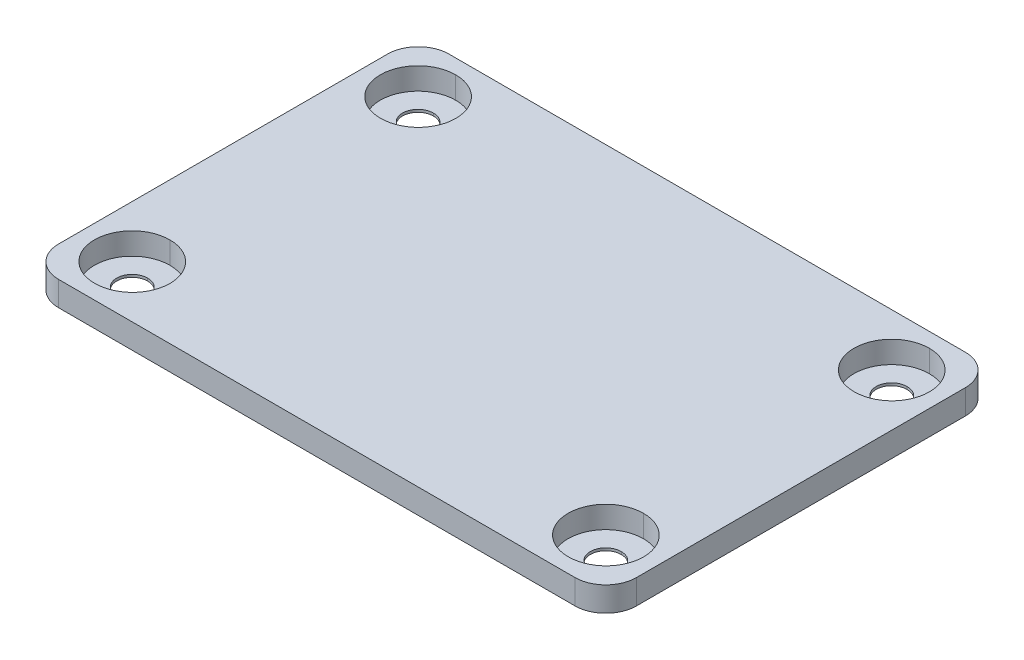
ISO-10303-21;
HEADER;
FILE_DESCRIPTION(('STEP AP214'),'2;1');
FILE_NAME('part.step','',(''),(''),'','','');
FILE_SCHEMA(('AUTOMOTIVE_DESIGN { 1 0 10303 214 1 1 1 1 }'));
ENDSEC;
DATA;
#1=APPLICATION_CONTEXT('core data for automotive mechanical design processes');
#2=APPLICATION_PROTOCOL_DEFINITION('international standard','automotive_design',2000,#1);
#3=PRODUCT_CONTEXT('',#1,'mechanical');
#4=PRODUCT('Part','Part','',(#3));
#5=PRODUCT_RELATED_PRODUCT_CATEGORY('part','',(#4));
#6=PRODUCT_DEFINITION_FORMATION('','',#4);
#7=PRODUCT_DEFINITION_CONTEXT('part definition',#1,'design');
#8=PRODUCT_DEFINITION('design','',#6,#7);
#9=PRODUCT_DEFINITION_SHAPE('','',#8);
#10=(LENGTH_UNIT() NAMED_UNIT(*) SI_UNIT(.MILLI.,.METRE.));
#11=(NAMED_UNIT(*) PLANE_ANGLE_UNIT() SI_UNIT($,.RADIAN.));
#12=(NAMED_UNIT(*) SI_UNIT($,.STERADIAN.) SOLID_ANGLE_UNIT());
#13=UNCERTAINTY_MEASURE_WITH_UNIT(LENGTH_MEASURE(1.E-05),#10,'distance_accuracy_value','');
#14=(GEOMETRIC_REPRESENTATION_CONTEXT(3) GLOBAL_UNCERTAINTY_ASSIGNED_CONTEXT((#13)) GLOBAL_UNIT_ASSIGNED_CONTEXT((#10,
#11,#12)) REPRESENTATION_CONTEXT('',''));
#15=CARTESIAN_POINT('',(0.,0.,0.));
#16=DIRECTION('',(0.,0.,1.));
#17=DIRECTION('',(1.,0.,0.));
#18=AXIS2_PLACEMENT_3D('',#15,#16,#17);
#19=CARTESIAN_POINT('',(-23.8468138885607,0.42,-47.7828830453356));
#20=DIRECTION('',(0.,-1.,0.));
#21=DIRECTION('',(0.,0.,-1.));
#22=AXIS2_PLACEMENT_3D('',#19,#20,#21);
#23=PLANE('',#22);
#24=CARTESIAN_POINT('',(-26.3468138885607,0.42,-47.7828830453356));
#25=DIRECTION('',(0.,1.,0.));
#26=DIRECTION('',(0.,0.,1.));
#27=AXIS2_PLACEMENT_3D('',#24,#25,#26);
#28=CIRCLE('',#27,6.12);
#29=CARTESIAN_POINT('',(-26.3218138885556,0.42,-53.902831983031));
#30=VERTEX_POINT('',#29);
#31=CARTESIAN_POINT('',(-26.3218138885658,0.42,-41.6629341076401));
#32=VERTEX_POINT('',#31);
#33=EDGE_CURVE('E226',#30,#32,#28,.T.);
#34=ORIENTED_EDGE('',*,*,#33,.T.);
#35=CARTESIAN_POINT('',(-26.2968138885607,0.42,-47.7828830453355));
#36=DIRECTION('',(0.,1.,0.));
#37=DIRECTION('',(0.,0.,1.));
#38=AXIS2_PLACEMENT_3D('',#35,#36,#37);
#39=CIRCLE('',#38,6.12);
#40=EDGE_CURVE('E686',#32,#30,#39,.T.);
#41=ORIENTED_EDGE('',*,*,#40,.T.);
#42=EDGE_LOOP('',(#34,#41));
#43=FACE_BOUND('',#42,.T.);
#44=CARTESIAN_POINT('',(-26.2968138885607,0.42,-47.7828830453355));
#45=DIRECTION('',(0.,1.,0.));
#46=DIRECTION('',(0.,0.,1.));
#47=AXIS2_PLACEMENT_3D('',#44,#45,#46);
#48=CIRCLE('',#47,2.5);
#49=CARTESIAN_POINT('',(-26.3218138885628,0.42,-45.2830080484607));
#50=VERTEX_POINT('',#49);
#51=CARTESIAN_POINT('',(-26.3218138885586,0.42,-50.2827580422104));
#52=VERTEX_POINT('',#51);
#53=EDGE_CURVE('E201',#50,#52,#48,.T.);
#54=ORIENTED_EDGE('',*,*,#53,.F.);
#55=CARTESIAN_POINT('',(-26.3468138885607,0.42,-47.7828830453356));
#56=DIRECTION('',(0.,1.,0.));
#57=DIRECTION('',(0.,0.,1.));
#58=AXIS2_PLACEMENT_3D('',#55,#56,#57);
#59=CIRCLE('',#58,2.5);
#60=EDGE_CURVE('E218',#52,#50,#59,.T.);
#61=ORIENTED_EDGE('',*,*,#60,.F.);
#62=EDGE_LOOP('',(#54,#61));
#63=FACE_BOUND('',#62,.T.);
#64=ADVANCED_FACE('F39',(#43,#63),#23,.F.);
#65=CARTESIAN_POINT('',(-23.8468138885607,0.42,-1.28288304533556));
#66=DIRECTION('',(0.,-1.,0.));
#67=DIRECTION('',(0.,0.,-1.));
#68=AXIS2_PLACEMENT_3D('',#65,#66,#67);
#69=PLANE('',#68);
#70=CARTESIAN_POINT('',(-26.3468138885607,0.42,-1.28288304533556));
#71=DIRECTION('',(0.,1.,0.));
#72=DIRECTION('',(0.,0.,1.));
#73=AXIS2_PLACEMENT_3D('',#70,#71,#72);
#74=CIRCLE('',#73,6.12);
#75=CARTESIAN_POINT('',(-26.3218138885596,0.42,-7.40283198303102));
#76=VERTEX_POINT('',#75);
#77=CARTESIAN_POINT('',(-26.3218138885619,0.42,4.83706589235992));
#78=VERTEX_POINT('',#77);
#79=EDGE_CURVE('E240',#76,#78,#74,.T.);
#80=ORIENTED_EDGE('',*,*,#79,.T.);
#81=CARTESIAN_POINT('',(-26.2968138885607,0.42,-1.28288304533555));
#82=DIRECTION('',(0.,1.,0.));
#83=DIRECTION('',(0.,0.,1.));
#84=AXIS2_PLACEMENT_3D('',#81,#82,#83);
#85=CIRCLE('',#84,6.12);
#86=EDGE_CURVE('E702',#78,#76,#85,.T.);
#87=ORIENTED_EDGE('',*,*,#86,.T.);
#88=EDGE_LOOP('',(#80,#87));
#89=FACE_BOUND('',#88,.T.);
#90=CARTESIAN_POINT('',(-26.2968138885607,0.42,-1.28288304533555));
#91=DIRECTION('',(0.,1.,0.));
#92=DIRECTION('',(0.,0.,1.));
#93=AXIS2_PLACEMENT_3D('',#90,#91,#92);
#94=CIRCLE('',#93,2.5);
#95=CARTESIAN_POINT('',(-26.3218138885612,0.42,1.21699195153929));
#96=VERTEX_POINT('',#95);
#97=CARTESIAN_POINT('',(-26.3218138885603,0.42,-3.78275804221039));
#98=VERTEX_POINT('',#97);
#99=EDGE_CURVE('E213',#96,#98,#94,.T.);
#100=ORIENTED_EDGE('',*,*,#99,.F.);
#101=CARTESIAN_POINT('',(-26.3468138885607,0.42,-1.28288304533556));
#102=DIRECTION('',(0.,1.,0.));
#103=DIRECTION('',(0.,0.,1.));
#104=AXIS2_PLACEMENT_3D('',#101,#102,#103);
#105=CIRCLE('',#104,2.5);
#106=EDGE_CURVE('E244',#98,#96,#105,.T.);
#107=ORIENTED_EDGE('',*,*,#106,.F.);
#108=EDGE_LOOP('',(#100,#107));
#109=FACE_BOUND('',#108,.T.);
#110=ADVANCED_FACE('F396',(#89,#109),#69,.F.);
#111=CARTESIAN_POINT('',(53.2031861114393,0.42,-47.7828830453356));
#112=DIRECTION('',(0.,-1.,0.));
#113=DIRECTION('',(0.,0.,-1.));
#114=AXIS2_PLACEMENT_3D('',#111,#112,#113);
#115=PLANE('',#114);
#116=CARTESIAN_POINT('',(50.7031861114393,0.42,-47.7828830453356));
#117=DIRECTION('',(0.,1.,0.));
#118=DIRECTION('',(0.,0.,1.));
#119=AXIS2_PLACEMENT_3D('',#116,#117,#118);
#120=CIRCLE('',#119,6.12);
#121=CARTESIAN_POINT('',(50.7281861114427,0.42,-53.902831983031));
#122=VERTEX_POINT('',#121);
#123=CARTESIAN_POINT('',(50.7281861114359,0.42,-41.6629341076401));
#124=VERTEX_POINT('',#123);
#125=EDGE_CURVE('E266',#122,#124,#120,.T.);
#126=ORIENTED_EDGE('',*,*,#125,.T.);
#127=CARTESIAN_POINT('',(50.7531861114393,0.42,-47.7828830453355));
#128=DIRECTION('',(0.,1.,0.));
#129=DIRECTION('',(0.,0.,1.));
#130=AXIS2_PLACEMENT_3D('',#127,#128,#129);
#131=CIRCLE('',#130,6.12);
#132=EDGE_CURVE('E731',#124,#122,#131,.T.);
#133=ORIENTED_EDGE('',*,*,#132,.T.);
#134=EDGE_LOOP('',(#126,#133));
#135=FACE_BOUND('',#134,.T.);
#136=CARTESIAN_POINT('',(50.7531861114393,0.42,-47.7828830453355));
#137=DIRECTION('',(0.,1.,0.));
#138=DIRECTION('',(0.,0.,1.));
#139=AXIS2_PLACEMENT_3D('',#136,#137,#138);
#140=CIRCLE('',#139,2.5);
#141=CARTESIAN_POINT('',(50.7281861114379,0.42,-45.2830080484607));
#142=VERTEX_POINT('',#141);
#143=CARTESIAN_POINT('',(50.7281861114407,0.42,-50.2827580422104));
#144=VERTEX_POINT('',#143);
#145=EDGE_CURVE('E708',#142,#144,#140,.T.);
#146=ORIENTED_EDGE('',*,*,#145,.F.);
#147=CARTESIAN_POINT('',(50.7031861114393,0.42,-47.7828830453356));
#148=DIRECTION('',(0.,1.,0.));
#149=DIRECTION('',(0.,0.,1.));
#150=AXIS2_PLACEMENT_3D('',#147,#148,#149);
#151=CIRCLE('',#150,2.5);
#152=EDGE_CURVE('E270',#144,#142,#151,.T.);
#153=ORIENTED_EDGE('',*,*,#152,.F.);
#154=EDGE_LOOP('',(#146,#153));
#155=FACE_BOUND('',#154,.T.);
#156=ADVANCED_FACE('F402',(#135,#155),#115,.F.);
#157=CARTESIAN_POINT('',(53.2031861114393,0.42,-1.28288304533555));
#158=DIRECTION('',(0.,-1.,0.));
#159=DIRECTION('',(0.,0.,-1.));
#160=AXIS2_PLACEMENT_3D('',#157,#158,#159);
#161=PLANE('',#160);
#162=CARTESIAN_POINT('',(50.7031861114393,0.42,-1.28288304533555));
#163=DIRECTION('',(0.,1.,0.));
#164=DIRECTION('',(0.,0.,1.));
#165=AXIS2_PLACEMENT_3D('',#162,#163,#164);
#166=CIRCLE('',#165,6.12);
#167=CARTESIAN_POINT('',(50.7281861114401,0.42,-7.40283198303103));
#168=VERTEX_POINT('',#167);
#169=CARTESIAN_POINT('',(50.7281861114384,0.42,4.83706589235993));
#170=VERTEX_POINT('',#169);
#171=EDGE_CURVE('E253',#168,#170,#166,.T.);
#172=ORIENTED_EDGE('',*,*,#171,.T.);
#173=CARTESIAN_POINT('',(50.7531861114393,0.42,-1.28288304533555));
#174=DIRECTION('',(0.,1.,0.));
#175=DIRECTION('',(0.,0.,1.));
#176=AXIS2_PLACEMENT_3D('',#173,#174,#175);
#177=CIRCLE('',#176,6.12);
#178=EDGE_CURVE('E759',#170,#168,#177,.T.);
#179=ORIENTED_EDGE('',*,*,#178,.T.);
#180=EDGE_LOOP('',(#172,#179));
#181=FACE_BOUND('',#180,.T.);
#182=CARTESIAN_POINT('',(50.7531861114393,0.42,-1.28288304533555));
#183=DIRECTION('',(0.,1.,0.));
#184=DIRECTION('',(0.,0.,1.));
#185=AXIS2_PLACEMENT_3D('',#182,#183,#184);
#186=CIRCLE('',#185,2.5);
#187=CARTESIAN_POINT('',(50.7281861114389,0.42,1.21699195153929));
#188=VERTEX_POINT('',#187);
#189=CARTESIAN_POINT('',(50.7281861114396,0.42,-3.78275804221039));
#190=VERTEX_POINT('',#189);
#191=EDGE_CURVE('E290',#188,#190,#186,.T.);
#192=ORIENTED_EDGE('',*,*,#191,.F.);
#193=CARTESIAN_POINT('',(50.7031861114393,0.42,-1.28288304533555));
#194=DIRECTION('',(0.,1.,0.));
#195=DIRECTION('',(0.,0.,1.));
#196=AXIS2_PLACEMENT_3D('',#193,#194,#195);
#197=CIRCLE('',#196,2.5);
#198=EDGE_CURVE('E257',#190,#188,#197,.T.);
#199=ORIENTED_EDGE('',*,*,#198,.F.);
#200=EDGE_LOOP('',(#192,#199));
#201=FACE_BOUND('',#200,.T.);
#202=ADVANCED_FACE('F424',(#181,#201),#161,.F.);
#203=CARTESIAN_POINT('',(-34.7968138885607,4.,-56.2828830453355));
#204=DIRECTION('',(1.,0.,0.));
#205=DIRECTION('',(0.,0.,-1.));
#206=AXIS2_PLACEMENT_3D('',#203,#204,#205);
#207=PLANE('',#206);
#208=DIRECTION('',(0.,0.,1.));
#209=VECTOR('',#208,1.);
#210=CARTESIAN_POINT('',(-34.7968138885607,0.,-56.2828830453355));
#211=LINE('',#210,#209);
#212=CARTESIAN_POINT('',(-34.7968138885607,0.,-51.2828830453356));
#213=VERTEX_POINT('',#212);
#214=CARTESIAN_POINT('',(-34.7968138885607,0.,2.21711695466446));
#215=VERTEX_POINT('',#214);
#216=EDGE_CURVE('E291',#213,#215,#211,.T.);
#217=ORIENTED_EDGE('',*,*,#216,.T.);
#218=DIRECTION('',(0.,-1.,0.));
#219=VECTOR('',#218,1.);
#220=CARTESIAN_POINT('',(-34.7968138885607,4.,2.21711695466446));
#221=LINE('',#220,#219);
#222=CARTESIAN_POINT('',(-34.7968138885607,4.,2.21711695466446));
#223=VERTEX_POINT('',#222);
#224=EDGE_CURVE('E11',#215,#223,#221,.F.);
#225=ORIENTED_EDGE('',*,*,#224,.T.);
#226=DIRECTION('',(0.,0.,1.));
#227=VECTOR('',#226,1.);
#228=CARTESIAN_POINT('',(-34.7968138885607,4.,-56.2828830453355));
#229=LINE('',#228,#227);
#230=CARTESIAN_POINT('',(-34.7968138885607,4.,-51.2828830453356));
#231=VERTEX_POINT('',#230);
#232=EDGE_CURVE('E275',#231,#223,#229,.T.);
#233=ORIENTED_EDGE('',*,*,#232,.F.);
#234=DIRECTION('',(0.,-1.,0.));
#235=VECTOR('',#234,1.);
#236=CARTESIAN_POINT('',(-34.7968138885607,4.,-51.2828830453356));
#237=LINE('',#236,#235);
#238=EDGE_CURVE('E48',#231,#213,#237,.T.);
#239=ORIENTED_EDGE('',*,*,#238,.T.);
#240=EDGE_LOOP('',(#217,#225,#233,#239));
#241=FACE_BOUND('',#240,.T.);
#242=ADVANCED_FACE('F361',(#241),#207,.F.);
#243=CARTESIAN_POINT('',(-34.7968138885607,4.,7.21711695466445));
#244=DIRECTION('',(0.,0.,-1.));
#245=DIRECTION('',(-1.,0.,0.));
#246=AXIS2_PLACEMENT_3D('',#243,#244,#245);
#247=PLANE('',#246);
#248=DIRECTION('',(1.,0.,0.));
#249=VECTOR('',#248,1.);
#250=CARTESIAN_POINT('',(-34.7968138885607,0.,7.21711695466445));
#251=LINE('',#250,#249);
#252=CARTESIAN_POINT('',(-29.7968138885607,0.,7.21711695466445));
#253=VERTEX_POINT('',#252);
#254=CARTESIAN_POINT('',(54.2031861114393,0.,7.21711695466445));
#255=VERTEX_POINT('',#254);
#256=EDGE_CURVE('E295',#253,#255,#251,.T.);
#257=ORIENTED_EDGE('',*,*,#256,.T.);
#258=DIRECTION('',(0.,-1.,0.));
#259=VECTOR('',#258,1.);
#260=CARTESIAN_POINT('',(54.2031861114393,4.,7.21711695466445));
#261=LINE('',#260,#259);
#262=CARTESIAN_POINT('',(54.2031861114393,4.,7.21711695466445));
#263=VERTEX_POINT('',#262);
#264=EDGE_CURVE('E336',#255,#263,#261,.F.);
#265=ORIENTED_EDGE('',*,*,#264,.T.);
#266=DIRECTION('',(1.,0.,0.));
#267=VECTOR('',#266,1.);
#268=CARTESIAN_POINT('',(-34.7968138885607,4.,7.21711695466445));
#269=LINE('',#268,#267);
#270=CARTESIAN_POINT('',(-29.7968138885607,4.,7.21711695466445));
#271=VERTEX_POINT('',#270);
#272=EDGE_CURVE('E279',#271,#263,#269,.T.);
#273=ORIENTED_EDGE('',*,*,#272,.F.);
#274=DIRECTION('',(0.,-1.,0.));
#275=VECTOR('',#274,1.);
#276=CARTESIAN_POINT('',(-29.7968138885607,4.,7.21711695466445));
#277=LINE('',#276,#275);
#278=EDGE_CURVE('E332',#271,#253,#277,.T.);
#279=ORIENTED_EDGE('',*,*,#278,.T.);
#280=EDGE_LOOP('',(#257,#265,#273,#279));
#281=FACE_BOUND('',#280,.T.);
#282=ADVANCED_FACE('F376',(#281),#247,.F.);
#283=CARTESIAN_POINT('',(59.2031861114393,4.,-56.2828830453355));
#284=DIRECTION('',(-1.,0.,0.));
#285=DIRECTION('',(0.,0.,1.));
#286=AXIS2_PLACEMENT_3D('',#283,#284,#285);
#287=PLANE('',#286);
#288=DIRECTION('',(0.,0.,-1.));
#289=VECTOR('',#288,1.);
#290=CARTESIAN_POINT('',(59.2031861114393,4.,-56.2828830453355));
#291=LINE('',#290,#289);
#292=CARTESIAN_POINT('',(59.2031861114393,4.,2.21711695466446));
#293=VERTEX_POINT('',#292);
#294=CARTESIAN_POINT('',(59.2031861114393,4.,-51.2828830453356));
#295=VERTEX_POINT('',#294);
#296=EDGE_CURVE('E284',#293,#295,#291,.T.);
#297=ORIENTED_EDGE('',*,*,#296,.F.);
#298=DIRECTION('',(0.,-1.,0.));
#299=VECTOR('',#298,1.);
#300=CARTESIAN_POINT('',(59.2031861114393,4.,2.21711695466446));
#301=LINE('',#300,#299);
#302=CARTESIAN_POINT('',(59.2031861114393,0.,2.21711695466446));
#303=VERTEX_POINT('',#302);
#304=EDGE_CURVE('E316',#293,#303,#301,.T.);
#305=ORIENTED_EDGE('',*,*,#304,.T.);
#306=DIRECTION('',(0.,0.,-1.));
#307=VECTOR('',#306,1.);
#308=CARTESIAN_POINT('',(59.2031861114393,0.,-56.2828830453355));
#309=LINE('',#308,#307);
#310=CARTESIAN_POINT('',(59.2031861114393,0.,-51.2828830453356));
#311=VERTEX_POINT('',#310);
#312=EDGE_CURVE('E299',#303,#311,#309,.T.);
#313=ORIENTED_EDGE('',*,*,#312,.T.);
#314=DIRECTION('',(0.,-1.,0.));
#315=VECTOR('',#314,1.);
#316=CARTESIAN_POINT('',(59.2031861114393,4.,-51.2828830453356));
#317=LINE('',#316,#315);
#318=EDGE_CURVE('E212',#311,#295,#317,.F.);
#319=ORIENTED_EDGE('',*,*,#318,.T.);
#320=EDGE_LOOP('',(#297,#305,#313,#319));
#321=FACE_BOUND('',#320,.T.);
#322=ADVANCED_FACE('F385',(#321),#287,.F.);
#323=CARTESIAN_POINT('',(-34.7968138885607,4.,-56.2828830453355));
#324=DIRECTION('',(0.,0.,1.));
#325=DIRECTION('',(1.,0.,0.));
#326=AXIS2_PLACEMENT_3D('',#323,#324,#325);
#327=PLANE('',#326);
#328=DIRECTION('',(-1.,0.,0.));
#329=VECTOR('',#328,1.);
#330=CARTESIAN_POINT('',(-34.7968138885607,4.,-56.2828830453355));
#331=LINE('',#330,#329);
#332=CARTESIAN_POINT('',(54.2031861114393,4.,-56.2828830453355));
#333=VERTEX_POINT('',#332);
#334=CARTESIAN_POINT('',(-29.7968138885607,4.,-56.2828830453355));
#335=VERTEX_POINT('',#334);
#336=EDGE_CURVE('E287',#333,#335,#331,.T.);
#337=ORIENTED_EDGE('',*,*,#336,.F.);
#338=DIRECTION('',(0.,-1.,0.));
#339=VECTOR('',#338,1.);
#340=CARTESIAN_POINT('',(54.2031861114393,4.,-56.2828830453355));
#341=LINE('',#340,#339);
#342=CARTESIAN_POINT('',(54.2031861114393,0.,-56.2828830453355));
#343=VERTEX_POINT('',#342);
#344=EDGE_CURVE('E352',#333,#343,#341,.T.);
#345=ORIENTED_EDGE('',*,*,#344,.T.);
#346=DIRECTION('',(-1.,0.,0.));
#347=VECTOR('',#346,1.);
#348=CARTESIAN_POINT('',(-34.7968138885607,0.,-56.2828830453355));
#349=LINE('',#348,#347);
#350=CARTESIAN_POINT('',(-29.7968138885607,0.,-56.2828830453355));
#351=VERTEX_POINT('',#350);
#352=EDGE_CURVE('E280',#343,#351,#349,.T.);
#353=ORIENTED_EDGE('',*,*,#352,.T.);
#354=DIRECTION('',(0.,-1.,0.));
#355=VECTOR('',#354,1.);
#356=CARTESIAN_POINT('',(-29.7968138885607,4.,-56.2828830453355));
#357=LINE('',#356,#355);
#358=EDGE_CURVE('E55',#351,#335,#357,.F.);
#359=ORIENTED_EDGE('',*,*,#358,.T.);
#360=EDGE_LOOP('',(#337,#345,#353,#359));
#361=FACE_BOUND('',#360,.T.);
#362=ADVANCED_FACE('F390',(#361),#327,.F.);
#363=CARTESIAN_POINT('',(0.,4.,0.));
#364=DIRECTION('',(0.,1.,0.));
#365=DIRECTION('',(0.,0.,1.));
#366=AXIS2_PLACEMENT_3D('',#363,#364,#365);
#367=PLANE('',#366);
#368=CARTESIAN_POINT('',(-26.2968138885607,4.,-47.7828830453355));
#369=DIRECTION('',(0.,1.,0.));
#370=DIRECTION('',(0.,0.,1.));
#371=AXIS2_PLACEMENT_3D('',#368,#369,#370);
#372=CIRCLE('',#371,6.12);
#373=CARTESIAN_POINT('',(-26.3218138885658,4.,-41.6629341076401));
#374=VERTEX_POINT('',#373);
#375=CARTESIAN_POINT('',(-26.3218138885556,4.,-53.902831983031));
#376=VERTEX_POINT('',#375);
#377=EDGE_CURVE('E688',#374,#376,#372,.T.);
#378=ORIENTED_EDGE('',*,*,#377,.F.);
#379=CARTESIAN_POINT('',(-26.3468138885607,4.,-47.7828830453356));
#380=DIRECTION('',(0.,1.,0.));
#381=DIRECTION('',(0.,0.,1.));
#382=AXIS2_PLACEMENT_3D('',#379,#380,#381);
#383=CIRCLE('',#382,6.12);
#384=EDGE_CURVE('E233',#376,#374,#383,.T.);
#385=ORIENTED_EDGE('',*,*,#384,.F.);
#386=EDGE_LOOP('',(#378,#385));
#387=FACE_BOUND('',#386,.T.);
#388=CARTESIAN_POINT('',(-26.2968138885607,4.,-1.28288304533555));
#389=DIRECTION('',(0.,1.,0.));
#390=DIRECTION('',(0.,0.,1.));
#391=AXIS2_PLACEMENT_3D('',#388,#389,#390);
#392=CIRCLE('',#391,6.12);
#393=CARTESIAN_POINT('',(-26.3218138885619,4.,4.83706589235992));
#394=VERTEX_POINT('',#393);
#395=CARTESIAN_POINT('',(-26.3218138885596,4.,-7.40283198303103));
#396=VERTEX_POINT('',#395);
#397=EDGE_CURVE('E222',#394,#396,#392,.T.);
#398=ORIENTED_EDGE('',*,*,#397,.F.);
#399=CARTESIAN_POINT('',(-26.3468138885607,4.,-1.28288304533556));
#400=DIRECTION('',(0.,1.,0.));
#401=DIRECTION('',(0.,0.,1.));
#402=AXIS2_PLACEMENT_3D('',#399,#400,#401);
#403=CIRCLE('',#402,6.12);
#404=EDGE_CURVE('E230',#396,#394,#403,.T.);
#405=ORIENTED_EDGE('',*,*,#404,.F.);
#406=EDGE_LOOP('',(#398,#405));
#407=FACE_BOUND('',#406,.T.);
#408=CARTESIAN_POINT('',(50.7531861114393,4.,-47.7828830453355));
#409=DIRECTION('',(0.,1.,0.));
#410=DIRECTION('',(0.,0.,1.));
#411=AXIS2_PLACEMENT_3D('',#408,#409,#410);
#412=CIRCLE('',#411,6.12);
#413=CARTESIAN_POINT('',(50.7281861114359,4.,-41.6629341076401));
#414=VERTEX_POINT('',#413);
#415=CARTESIAN_POINT('',(50.7281861114427,4.,-53.902831983031));
#416=VERTEX_POINT('',#415);
#417=EDGE_CURVE('E728',#414,#416,#412,.T.);
#418=ORIENTED_EDGE('',*,*,#417,.F.);
#419=CARTESIAN_POINT('',(50.7031861114393,4.,-47.7828830453356));
#420=DIRECTION('',(0.,1.,0.));
#421=DIRECTION('',(0.,0.,1.));
#422=AXIS2_PLACEMENT_3D('',#419,#420,#421);
#423=CIRCLE('',#422,6.12);
#424=EDGE_CURVE('E262',#416,#414,#423,.T.);
#425=ORIENTED_EDGE('',*,*,#424,.F.);
#426=EDGE_LOOP('',(#418,#425));
#427=FACE_BOUND('',#426,.T.);
#428=CARTESIAN_POINT('',(50.7531861114393,4.,-1.28288304533555));
#429=DIRECTION('',(0.,1.,0.));
#430=DIRECTION('',(0.,0.,1.));
#431=AXIS2_PLACEMENT_3D('',#428,#429,#430);
#432=CIRCLE('',#431,6.12);
#433=CARTESIAN_POINT('',(50.7281861114384,4.,4.83706589235993));
#434=VERTEX_POINT('',#433);
#435=CARTESIAN_POINT('',(50.7281861114401,4.,-7.40283198303103));
#436=VERTEX_POINT('',#435);
#437=EDGE_CURVE('E756',#434,#436,#432,.T.);
#438=ORIENTED_EDGE('',*,*,#437,.F.);
#439=CARTESIAN_POINT('',(50.7031861114393,4.,-1.28288304533555));
#440=DIRECTION('',(0.,1.,0.));
#441=DIRECTION('',(0.,0.,1.));
#442=AXIS2_PLACEMENT_3D('',#439,#440,#441);
#443=CIRCLE('',#442,6.12);
#444=EDGE_CURVE('E249',#436,#434,#443,.T.);
#445=ORIENTED_EDGE('',*,*,#444,.F.);
#446=EDGE_LOOP('',(#438,#445));
#447=FACE_BOUND('',#446,.T.);
#448=ORIENTED_EDGE('',*,*,#272,.T.);
#449=CARTESIAN_POINT('',(54.2031861114393,4.,2.21711695466446));
#450=DIRECTION('',(0.,1.,0.));
#451=DIRECTION('',(0.,0.,1.));
#452=AXIS2_PLACEMENT_3D('',#449,#450,#451);
#453=CIRCLE('',#452,5.);
#454=EDGE_CURVE('E347',#263,#293,#453,.T.);
#455=ORIENTED_EDGE('',*,*,#454,.T.);
#456=ORIENTED_EDGE('',*,*,#296,.T.);
#457=CARTESIAN_POINT('',(54.2031861114393,4.,-51.2828830453356));
#458=DIRECTION('',(0.,1.,0.));
#459=DIRECTION('',(0.,0.,1.));
#460=AXIS2_PLACEMENT_3D('',#457,#458,#459);
#461=CIRCLE('',#460,5.);
#462=EDGE_CURVE('E62',#295,#333,#461,.T.);
#463=ORIENTED_EDGE('',*,*,#462,.T.);
#464=ORIENTED_EDGE('',*,*,#336,.T.);
#465=CARTESIAN_POINT('',(-29.7968138885607,4.,-51.2828830453356));
#466=DIRECTION('',(0.,1.,0.));
#467=DIRECTION('',(0.,0.,1.));
#468=AXIS2_PLACEMENT_3D('',#465,#466,#467);
#469=CIRCLE('',#468,5.);
#470=EDGE_CURVE('E339',#335,#231,#469,.T.);
#471=ORIENTED_EDGE('',*,*,#470,.T.);
#472=ORIENTED_EDGE('',*,*,#232,.T.);
#473=CARTESIAN_POINT('',(-29.7968138885607,4.,2.21711695466445));
#474=DIRECTION('',(0.,1.,0.));
#475=DIRECTION('',(0.,0.,1.));
#476=AXIS2_PLACEMENT_3D('',#473,#474,#475);
#477=CIRCLE('',#476,5.);
#478=EDGE_CURVE('E342',#223,#271,#477,.T.);
#479=ORIENTED_EDGE('',*,*,#478,.T.);
#480=EDGE_LOOP('',(#448,#455,#456,#463,#464,#471,#472,#479));
#481=FACE_BOUND('',#480,.T.);
#482=ADVANCED_FACE('F379',(#387,#407,#427,#447,#481),#367,.T.);
#483=CARTESIAN_POINT('',(0.,0.,0.));
#484=DIRECTION('',(0.,1.,0.));
#485=DIRECTION('',(0.,0.,1.));
#486=AXIS2_PLACEMENT_3D('',#483,#484,#485);
#487=PLANE('',#486);
#488=CARTESIAN_POINT('',(-26.3468138885607,0.,-47.7828830453356));
#489=DIRECTION('',(0.,1.,0.));
#490=DIRECTION('',(0.,0.,1.));
#491=AXIS2_PLACEMENT_3D('',#488,#489,#490);
#492=CIRCLE('',#491,2.5);
#493=CARTESIAN_POINT('',(-26.3218138885586,0.,-50.2827580422104));
#494=VERTEX_POINT('',#493);
#495=CARTESIAN_POINT('',(-26.3218138885628,0.,-45.2830080484607));
#496=VERTEX_POINT('',#495);
#497=EDGE_CURVE('E220',#494,#496,#492,.T.);
#498=ORIENTED_EDGE('',*,*,#497,.T.);
#499=CARTESIAN_POINT('',(-26.2968138885607,0.,-47.7828830453355));
#500=DIRECTION('',(0.,1.,0.));
#501=DIRECTION('',(0.,0.,1.));
#502=AXIS2_PLACEMENT_3D('',#499,#500,#501);
#503=CIRCLE('',#502,2.5);
#504=EDGE_CURVE('E223',#496,#494,#503,.T.);
#505=ORIENTED_EDGE('',*,*,#504,.T.);
#506=EDGE_LOOP('',(#498,#505));
#507=FACE_BOUND('',#506,.T.);
#508=CARTESIAN_POINT('',(-26.3468138885607,0.,-1.28288304533556));
#509=DIRECTION('',(0.,1.,0.));
#510=DIRECTION('',(0.,0.,1.));
#511=AXIS2_PLACEMENT_3D('',#508,#509,#510);
#512=CIRCLE('',#511,2.5);
#513=CARTESIAN_POINT('',(-26.3218138885603,0.,-3.78275804221039));
#514=VERTEX_POINT('',#513);
#515=CARTESIAN_POINT('',(-26.3218138885612,0.,1.21699195153929));
#516=VERTEX_POINT('',#515);
#517=EDGE_CURVE('E248',#514,#516,#512,.T.);
#518=ORIENTED_EDGE('',*,*,#517,.T.);
#519=CARTESIAN_POINT('',(-26.2968138885607,0.,-1.28288304533555));
#520=DIRECTION('',(0.,1.,0.));
#521=DIRECTION('',(0.,0.,1.));
#522=AXIS2_PLACEMENT_3D('',#519,#520,#521);
#523=CIRCLE('',#522,2.5);
#524=EDGE_CURVE('E720',#516,#514,#523,.T.);
#525=ORIENTED_EDGE('',*,*,#524,.T.);
#526=EDGE_LOOP('',(#518,#525));
#527=FACE_BOUND('',#526,.T.);
#528=CARTESIAN_POINT('',(50.7031861114393,0.,-1.28288304533555));
#529=DIRECTION('',(0.,1.,0.));
#530=DIRECTION('',(0.,0.,1.));
#531=AXIS2_PLACEMENT_3D('',#528,#529,#530);
#532=CIRCLE('',#531,2.5);
#533=CARTESIAN_POINT('',(50.7281861114396,0.,-3.78275804221039));
#534=VERTEX_POINT('',#533);
#535=CARTESIAN_POINT('',(50.7281861114389,0.,1.21699195153929));
#536=VERTEX_POINT('',#535);
#537=EDGE_CURVE('E261',#534,#536,#532,.T.);
#538=ORIENTED_EDGE('',*,*,#537,.T.);
#539=CARTESIAN_POINT('',(50.7531861114393,0.,-1.28288304533555));
#540=DIRECTION('',(0.,1.,0.));
#541=DIRECTION('',(0.,0.,1.));
#542=AXIS2_PLACEMENT_3D('',#539,#540,#541);
#543=CIRCLE('',#542,2.5);
#544=EDGE_CURVE('E768',#536,#534,#543,.T.);
#545=ORIENTED_EDGE('',*,*,#544,.T.);
#546=EDGE_LOOP('',(#538,#545));
#547=FACE_BOUND('',#546,.T.);
#548=CARTESIAN_POINT('',(50.7031861114393,0.,-47.7828830453356));
#549=DIRECTION('',(0.,1.,0.));
#550=DIRECTION('',(0.,0.,1.));
#551=AXIS2_PLACEMENT_3D('',#548,#549,#550);
#552=CIRCLE('',#551,2.5);
#553=CARTESIAN_POINT('',(50.7281861114407,0.,-50.2827580422104));
#554=VERTEX_POINT('',#553);
#555=CARTESIAN_POINT('',(50.7281861114379,0.,-45.2830080484607));
#556=VERTEX_POINT('',#555);
#557=EDGE_CURVE('E274',#554,#556,#552,.T.);
#558=ORIENTED_EDGE('',*,*,#557,.T.);
#559=CARTESIAN_POINT('',(50.7531861114393,0.,-47.7828830453355));
#560=DIRECTION('',(0.,1.,0.));
#561=DIRECTION('',(0.,0.,1.));
#562=AXIS2_PLACEMENT_3D('',#559,#560,#561);
#563=CIRCLE('',#562,2.5);
#564=EDGE_CURVE('E748',#556,#554,#563,.T.);
#565=ORIENTED_EDGE('',*,*,#564,.T.);
#566=EDGE_LOOP('',(#558,#565));
#567=FACE_BOUND('',#566,.T.);
#568=ORIENTED_EDGE('',*,*,#312,.F.);
#569=CARTESIAN_POINT('',(54.2031861114393,0.,2.21711695466446));
#570=DIRECTION('',(0.,1.,0.));
#571=DIRECTION('',(0.,0.,1.));
#572=AXIS2_PLACEMENT_3D('',#569,#570,#571);
#573=CIRCLE('',#572,5.);
#574=EDGE_CURVE('E329',#303,#255,#573,.F.);
#575=ORIENTED_EDGE('',*,*,#574,.T.);
#576=ORIENTED_EDGE('',*,*,#256,.F.);
#577=CARTESIAN_POINT('',(-29.7968138885607,0.,2.21711695466445));
#578=DIRECTION('',(0.,1.,0.));
#579=DIRECTION('',(0.,0.,1.));
#580=AXIS2_PLACEMENT_3D('',#577,#578,#579);
#581=CIRCLE('',#580,5.);
#582=EDGE_CURVE('E323',#253,#215,#581,.F.);
#583=ORIENTED_EDGE('',*,*,#582,.T.);
#584=ORIENTED_EDGE('',*,*,#216,.F.);
#585=CARTESIAN_POINT('',(-29.7968138885607,0.,-51.2828830453356));
#586=DIRECTION('',(0.,1.,0.));
#587=DIRECTION('',(0.,0.,1.));
#588=AXIS2_PLACEMENT_3D('',#585,#586,#587);
#589=CIRCLE('',#588,5.);
#590=EDGE_CURVE('E320',#213,#351,#589,.F.);
#591=ORIENTED_EDGE('',*,*,#590,.T.);
#592=ORIENTED_EDGE('',*,*,#352,.F.);
#593=CARTESIAN_POINT('',(54.2031861114393,0.,-51.2828830453356));
#594=DIRECTION('',(0.,1.,0.));
#595=DIRECTION('',(0.,0.,1.));
#596=AXIS2_PLACEMENT_3D('',#593,#594,#595);
#597=CIRCLE('',#596,5.);
#598=EDGE_CURVE('E326',#343,#311,#597,.F.);
#599=ORIENTED_EDGE('',*,*,#598,.T.);
#600=EDGE_LOOP('',(#568,#575,#576,#583,#584,#591,#592,#599));
#601=FACE_BOUND('',#600,.T.);
#602=ADVANCED_FACE('F367',(#507,#527,#547,#567,#601),#487,.F.);
#603=CARTESIAN_POINT('',(50.7031861114393,4.,-47.7828830453356));
#604=DIRECTION('',(0.,1.,0.));
#605=DIRECTION('',(0.,0.,1.));
#606=AXIS2_PLACEMENT_3D('',#603,#604,#605);
#607=CYLINDRICAL_SURFACE('',#606,2.5);
#608=ORIENTED_EDGE('',*,*,#557,.F.);
#609=DIRECTION('',(0.,1.,0.));
#610=VECTOR('',#609,1.);
#611=CARTESIAN_POINT('',(50.7281861114407,-6.79,-50.2827580422104));
#612=LINE('',#611,#610);
#613=EDGE_CURVE('E752',#554,#144,#612,.T.);
#614=ORIENTED_EDGE('',*,*,#613,.T.);
#615=ORIENTED_EDGE('',*,*,#152,.T.);
#616=DIRECTION('',(0.,1.,0.));
#617=VECTOR('',#616,1.);
#618=CARTESIAN_POINT('',(50.7281861114379,-6.79,-45.2830080484607));
#619=LINE('',#618,#617);
#620=EDGE_CURVE('E744',#142,#556,#619,.F.);
#621=ORIENTED_EDGE('',*,*,#620,.T.);
#622=EDGE_LOOP('',(#608,#614,#615,#621));
#623=FACE_BOUND('',#622,.T.);
#624=ADVANCED_FACE('F434',(#623),#607,.F.);
#625=CARTESIAN_POINT('',(50.7031861114393,4.,-47.7828830453356));
#626=DIRECTION('',(0.,1.,0.));
#627=DIRECTION('',(0.,0.,1.));
#628=AXIS2_PLACEMENT_3D('',#625,#626,#627);
#629=CYLINDRICAL_SURFACE('',#628,6.12);
#630=ORIENTED_EDGE('',*,*,#125,.F.);
#631=DIRECTION('',(0.,1.,0.));
#632=VECTOR('',#631,1.);
#633=CARTESIAN_POINT('',(50.7281861114427,2.21,-53.902831983031));
#634=LINE('',#633,#632);
#635=EDGE_CURVE('E740',#122,#416,#634,.T.);
#636=ORIENTED_EDGE('',*,*,#635,.T.);
#637=ORIENTED_EDGE('',*,*,#424,.T.);
#638=DIRECTION('',(0.,1.,0.));
#639=VECTOR('',#638,1.);
#640=CARTESIAN_POINT('',(50.7281861114359,2.21,-41.6629341076401));
#641=LINE('',#640,#639);
#642=EDGE_CURVE('E734',#414,#124,#641,.F.);
#643=ORIENTED_EDGE('',*,*,#642,.T.);
#644=EDGE_LOOP('',(#630,#636,#637,#643));
#645=FACE_BOUND('',#644,.T.);
#646=ADVANCED_FACE('F430',(#645),#629,.F.);
#647=CARTESIAN_POINT('',(50.7031861114393,4.,-1.28288304533555));
#648=DIRECTION('',(0.,1.,0.));
#649=DIRECTION('',(0.,0.,1.));
#650=AXIS2_PLACEMENT_3D('',#647,#648,#649);
#651=CYLINDRICAL_SURFACE('',#650,2.5);
#652=ORIENTED_EDGE('',*,*,#537,.F.);
#653=DIRECTION('',(0.,1.,0.));
#654=VECTOR('',#653,1.);
#655=CARTESIAN_POINT('',(50.7281861114396,-6.79,-3.78275804221039));
#656=LINE('',#655,#654);
#657=EDGE_CURVE('E772',#534,#190,#656,.T.);
#658=ORIENTED_EDGE('',*,*,#657,.T.);
#659=ORIENTED_EDGE('',*,*,#198,.T.);
#660=DIRECTION('',(0.,1.,0.));
#661=VECTOR('',#660,1.);
#662=CARTESIAN_POINT('',(50.7281861114389,-6.79,1.21699195153929));
#663=LINE('',#662,#661);
#664=EDGE_CURVE('E762',#188,#536,#663,.F.);
#665=ORIENTED_EDGE('',*,*,#664,.T.);
#666=EDGE_LOOP('',(#652,#658,#659,#665));
#667=FACE_BOUND('',#666,.T.);
#668=ADVANCED_FACE('F422',(#667),#651,.F.);
#669=CARTESIAN_POINT('',(50.7031861114393,4.,-1.28288304533555));
#670=DIRECTION('',(0.,1.,0.));
#671=DIRECTION('',(0.,0.,1.));
#672=AXIS2_PLACEMENT_3D('',#669,#670,#671);
#673=CYLINDRICAL_SURFACE('',#672,6.12);
#674=ORIENTED_EDGE('',*,*,#171,.F.);
#675=DIRECTION('',(0.,1.,0.));
#676=VECTOR('',#675,1.);
#677=CARTESIAN_POINT('',(50.7281861114401,2.21,-7.40283198303103));
#678=LINE('',#677,#676);
#679=EDGE_CURVE('E780',#168,#436,#678,.T.);
#680=ORIENTED_EDGE('',*,*,#679,.T.);
#681=ORIENTED_EDGE('',*,*,#444,.T.);
#682=DIRECTION('',(0.,1.,0.));
#683=VECTOR('',#682,1.);
#684=CARTESIAN_POINT('',(50.7281861114384,2.21,4.83706589235993));
#685=LINE('',#684,#683);
#686=EDGE_CURVE('E776',#434,#170,#685,.F.);
#687=ORIENTED_EDGE('',*,*,#686,.T.);
#688=EDGE_LOOP('',(#674,#680,#681,#687));
#689=FACE_BOUND('',#688,.T.);
#690=ADVANCED_FACE('F418',(#689),#673,.F.);
#691=CARTESIAN_POINT('',(-26.3468138885607,4.,-1.28288304533556));
#692=DIRECTION('',(0.,1.,0.));
#693=DIRECTION('',(0.,0.,1.));
#694=AXIS2_PLACEMENT_3D('',#691,#692,#693);
#695=CYLINDRICAL_SURFACE('',#694,2.5);
#696=ORIENTED_EDGE('',*,*,#517,.F.);
#697=DIRECTION('',(0.,1.,0.));
#698=VECTOR('',#697,1.);
#699=CARTESIAN_POINT('',(-26.3218138885603,-6.79,-3.78275804221039));
#700=LINE('',#699,#698);
#701=EDGE_CURVE('E724',#514,#98,#700,.T.);
#702=ORIENTED_EDGE('',*,*,#701,.T.);
#703=ORIENTED_EDGE('',*,*,#106,.T.);
#704=DIRECTION('',(0.,1.,0.));
#705=VECTOR('',#704,1.);
#706=CARTESIAN_POINT('',(-26.3218138885612,-6.79,1.21699195153929));
#707=LINE('',#706,#705);
#708=EDGE_CURVE('E716',#96,#516,#707,.F.);
#709=ORIENTED_EDGE('',*,*,#708,.T.);
#710=EDGE_LOOP('',(#696,#702,#703,#709));
#711=FACE_BOUND('',#710,.T.);
#712=ADVANCED_FACE('F413',(#711),#695,.F.);
#713=CARTESIAN_POINT('',(-26.3468138885607,4.,-1.28288304533556));
#714=DIRECTION('',(0.,1.,0.));
#715=DIRECTION('',(0.,0.,1.));
#716=AXIS2_PLACEMENT_3D('',#713,#714,#715);
#717=CYLINDRICAL_SURFACE('',#716,6.12);
#718=ORIENTED_EDGE('',*,*,#79,.F.);
#719=DIRECTION('',(0.,1.,0.));
#720=VECTOR('',#719,1.);
#721=CARTESIAN_POINT('',(-26.3218138885596,2.21,-7.40283198303103));
#722=LINE('',#721,#720);
#723=EDGE_CURVE('E712',#76,#396,#722,.T.);
#724=ORIENTED_EDGE('',*,*,#723,.T.);
#725=ORIENTED_EDGE('',*,*,#404,.T.);
#726=DIRECTION('',(0.,1.,0.));
#727=VECTOR('',#726,1.);
#728=CARTESIAN_POINT('',(-26.3218138885619,2.21,4.83706589235992));
#729=LINE('',#728,#727);
#730=EDGE_CURVE('E705',#394,#78,#729,.F.);
#731=ORIENTED_EDGE('',*,*,#730,.T.);
#732=EDGE_LOOP('',(#718,#724,#725,#731));
#733=FACE_BOUND('',#732,.T.);
#734=ADVANCED_FACE('F411',(#733),#717,.F.);
#735=CARTESIAN_POINT('',(-26.3468138885607,4.,-47.7828830453356));
#736=DIRECTION('',(0.,1.,0.));
#737=DIRECTION('',(0.,0.,1.));
#738=AXIS2_PLACEMENT_3D('',#735,#736,#737);
#739=CYLINDRICAL_SURFACE('',#738,2.5);
#740=ORIENTED_EDGE('',*,*,#497,.F.);
#741=DIRECTION('',(0.,1.,0.));
#742=VECTOR('',#741,1.);
#743=CARTESIAN_POINT('',(-26.3218138885586,-6.79,-50.2827580422104));
#744=LINE('',#743,#742);
#745=EDGE_CURVE('E204',#494,#52,#744,.T.);
#746=ORIENTED_EDGE('',*,*,#745,.T.);
#747=ORIENTED_EDGE('',*,*,#60,.T.);
#748=DIRECTION('',(0.,1.,0.));
#749=VECTOR('',#748,1.);
#750=CARTESIAN_POINT('',(-26.3218138885628,-6.79,-45.2830080484607));
#751=LINE('',#750,#749);
#752=EDGE_CURVE('E207',#50,#496,#751,.F.);
#753=ORIENTED_EDGE('',*,*,#752,.T.);
#754=EDGE_LOOP('',(#740,#746,#747,#753));
#755=FACE_BOUND('',#754,.T.);
#756=ADVANCED_FACE('F217',(#755),#739,.F.);
#757=CARTESIAN_POINT('',(-26.3468138885607,4.,-47.7828830453356));
#758=DIRECTION('',(0.,1.,0.));
#759=DIRECTION('',(0.,0.,1.));
#760=AXIS2_PLACEMENT_3D('',#757,#758,#759);
#761=CYLINDRICAL_SURFACE('',#760,6.12);
#762=ORIENTED_EDGE('',*,*,#33,.F.);
#763=DIRECTION('',(0.,1.,0.));
#764=VECTOR('',#763,1.);
#765=CARTESIAN_POINT('',(-26.3218138885556,2.21,-53.902831983031));
#766=LINE('',#765,#764);
#767=EDGE_CURVE('E683',#30,#376,#766,.T.);
#768=ORIENTED_EDGE('',*,*,#767,.T.);
#769=ORIENTED_EDGE('',*,*,#384,.T.);
#770=DIRECTION('',(0.,1.,0.));
#771=VECTOR('',#770,1.);
#772=CARTESIAN_POINT('',(-26.3218138885658,2.21,-41.6629341076401));
#773=LINE('',#772,#771);
#774=EDGE_CURVE('E685',#374,#32,#773,.F.);
#775=ORIENTED_EDGE('',*,*,#774,.T.);
#776=EDGE_LOOP('',(#762,#768,#769,#775));
#777=FACE_BOUND('',#776,.T.);
#778=ADVANCED_FACE('F407',(#777),#761,.F.);
#779=CARTESIAN_POINT('',(50.7531861114393,4.,-1.28288304533555));
#780=DIRECTION('',(0.,1.,0.));
#781=DIRECTION('',(0.,0.,1.));
#782=AXIS2_PLACEMENT_3D('',#779,#780,#781);
#783=CYLINDRICAL_SURFACE('',#782,2.5);
#784=ORIENTED_EDGE('',*,*,#544,.F.);
#785=ORIENTED_EDGE('',*,*,#664,.F.);
#786=ORIENTED_EDGE('',*,*,#191,.T.);
#787=ORIENTED_EDGE('',*,*,#657,.F.);
#788=EDGE_LOOP('',(#784,#785,#786,#787));
#789=FACE_BOUND('',#788,.T.);
#790=ADVANCED_FACE('F542',(#789),#783,.F.);
#791=CARTESIAN_POINT('',(50.7531861114393,4.,-1.28288304533555));
#792=DIRECTION('',(0.,1.,0.));
#793=DIRECTION('',(0.,0.,1.));
#794=AXIS2_PLACEMENT_3D('',#791,#792,#793);
#795=CYLINDRICAL_SURFACE('',#794,6.12);
#796=ORIENTED_EDGE('',*,*,#178,.F.);
#797=ORIENTED_EDGE('',*,*,#686,.F.);
#798=ORIENTED_EDGE('',*,*,#437,.T.);
#799=ORIENTED_EDGE('',*,*,#679,.F.);
#800=EDGE_LOOP('',(#796,#797,#798,#799));
#801=FACE_BOUND('',#800,.T.);
#802=ADVANCED_FACE('F533',(#801),#795,.F.);
#803=CARTESIAN_POINT('',(50.7531861114393,4.,-47.7828830453355));
#804=DIRECTION('',(0.,1.,0.));
#805=DIRECTION('',(0.,0.,1.));
#806=AXIS2_PLACEMENT_3D('',#803,#804,#805);
#807=CYLINDRICAL_SURFACE('',#806,2.5);
#808=ORIENTED_EDGE('',*,*,#564,.F.);
#809=ORIENTED_EDGE('',*,*,#620,.F.);
#810=ORIENTED_EDGE('',*,*,#145,.T.);
#811=ORIENTED_EDGE('',*,*,#613,.F.);
#812=EDGE_LOOP('',(#808,#809,#810,#811));
#813=FACE_BOUND('',#812,.T.);
#814=ADVANCED_FACE('F524',(#813),#807,.F.);
#815=CARTESIAN_POINT('',(50.7531861114393,4.,-47.7828830453355));
#816=DIRECTION('',(0.,1.,0.));
#817=DIRECTION('',(0.,0.,1.));
#818=AXIS2_PLACEMENT_3D('',#815,#816,#817);
#819=CYLINDRICAL_SURFACE('',#818,6.12);
#820=ORIENTED_EDGE('',*,*,#132,.F.);
#821=ORIENTED_EDGE('',*,*,#642,.F.);
#822=ORIENTED_EDGE('',*,*,#417,.T.);
#823=ORIENTED_EDGE('',*,*,#635,.F.);
#824=EDGE_LOOP('',(#820,#821,#822,#823));
#825=FACE_BOUND('',#824,.T.);
#826=ADVANCED_FACE('F515',(#825),#819,.F.);
#827=CARTESIAN_POINT('',(-26.2968138885607,4.,-1.28288304533555));
#828=DIRECTION('',(0.,1.,0.));
#829=DIRECTION('',(0.,0.,1.));
#830=AXIS2_PLACEMENT_3D('',#827,#828,#829);
#831=CYLINDRICAL_SURFACE('',#830,2.5);
#832=ORIENTED_EDGE('',*,*,#524,.F.);
#833=ORIENTED_EDGE('',*,*,#708,.F.);
#834=ORIENTED_EDGE('',*,*,#99,.T.);
#835=ORIENTED_EDGE('',*,*,#701,.F.);
#836=EDGE_LOOP('',(#832,#833,#834,#835));
#837=FACE_BOUND('',#836,.T.);
#838=ADVANCED_FACE('F506',(#837),#831,.F.);
#839=CARTESIAN_POINT('',(-26.2968138885607,4.,-1.28288304533555));
#840=DIRECTION('',(0.,1.,0.));
#841=DIRECTION('',(0.,0.,1.));
#842=AXIS2_PLACEMENT_3D('',#839,#840,#841);
#843=CYLINDRICAL_SURFACE('',#842,6.12);
#844=ORIENTED_EDGE('',*,*,#86,.F.);
#845=ORIENTED_EDGE('',*,*,#730,.F.);
#846=ORIENTED_EDGE('',*,*,#397,.T.);
#847=ORIENTED_EDGE('',*,*,#723,.F.);
#848=EDGE_LOOP('',(#844,#845,#846,#847));
#849=FACE_BOUND('',#848,.T.);
#850=ADVANCED_FACE('F498',(#849),#843,.F.);
#851=CARTESIAN_POINT('',(-26.2968138885607,4.,-47.7828830453355));
#852=DIRECTION('',(0.,1.,0.));
#853=DIRECTION('',(0.,0.,1.));
#854=AXIS2_PLACEMENT_3D('',#851,#852,#853);
#855=CYLINDRICAL_SURFACE('',#854,2.5);
#856=ORIENTED_EDGE('',*,*,#504,.F.);
#857=ORIENTED_EDGE('',*,*,#752,.F.);
#858=ORIENTED_EDGE('',*,*,#53,.T.);
#859=ORIENTED_EDGE('',*,*,#745,.F.);
#860=EDGE_LOOP('',(#856,#857,#858,#859));
#861=FACE_BOUND('',#860,.T.);
#862=ADVANCED_FACE('F203',(#861),#855,.F.);
#863=CARTESIAN_POINT('',(-26.2968138885607,4.,-47.7828830453355));
#864=DIRECTION('',(0.,1.,0.));
#865=DIRECTION('',(0.,0.,1.));
#866=AXIS2_PLACEMENT_3D('',#863,#864,#865);
#867=CYLINDRICAL_SURFACE('',#866,6.12);
#868=ORIENTED_EDGE('',*,*,#40,.F.);
#869=ORIENTED_EDGE('',*,*,#774,.F.);
#870=ORIENTED_EDGE('',*,*,#377,.T.);
#871=ORIENTED_EDGE('',*,*,#767,.F.);
#872=EDGE_LOOP('',(#868,#869,#870,#871));
#873=FACE_BOUND('',#872,.T.);
#874=ADVANCED_FACE('F458',(#873),#867,.F.);
#875=CARTESIAN_POINT('',(54.2031861114393,4.,2.21711695466446));
#876=DIRECTION('',(0.,-1.,0.));
#877=DIRECTION('',(0.,0.,-1.));
#878=AXIS2_PLACEMENT_3D('',#875,#876,#877);
#879=CYLINDRICAL_SURFACE('',#878,5.);
#880=ORIENTED_EDGE('',*,*,#454,.F.);
#881=ORIENTED_EDGE('',*,*,#264,.F.);
#882=ORIENTED_EDGE('',*,*,#574,.F.);
#883=ORIENTED_EDGE('',*,*,#304,.F.);
#884=EDGE_LOOP('',(#880,#881,#882,#883));
#885=FACE_BOUND('',#884,.T.);
#886=ADVANCED_FACE('F383',(#885),#879,.T.);
#887=CARTESIAN_POINT('',(54.2031861114393,4.,-51.2828830453356));
#888=DIRECTION('',(0.,-1.,0.));
#889=DIRECTION('',(0.,0.,-1.));
#890=AXIS2_PLACEMENT_3D('',#887,#888,#889);
#891=CYLINDRICAL_SURFACE('',#890,5.);
#892=ORIENTED_EDGE('',*,*,#462,.F.);
#893=ORIENTED_EDGE('',*,*,#318,.F.);
#894=ORIENTED_EDGE('',*,*,#598,.F.);
#895=ORIENTED_EDGE('',*,*,#344,.F.);
#896=EDGE_LOOP('',(#892,#893,#894,#895));
#897=FACE_BOUND('',#896,.T.);
#898=ADVANCED_FACE('F389',(#897),#891,.T.);
#899=CARTESIAN_POINT('',(-29.7968138885607,4.,2.21711695466445));
#900=DIRECTION('',(0.,-1.,0.));
#901=DIRECTION('',(0.,0.,-1.));
#902=AXIS2_PLACEMENT_3D('',#899,#900,#901);
#903=CYLINDRICAL_SURFACE('',#902,5.);
#904=ORIENTED_EDGE('',*,*,#478,.F.);
#905=ORIENTED_EDGE('',*,*,#224,.F.);
#906=ORIENTED_EDGE('',*,*,#582,.F.);
#907=ORIENTED_EDGE('',*,*,#278,.F.);
#908=EDGE_LOOP('',(#904,#905,#906,#907));
#909=FACE_BOUND('',#908,.T.);
#910=ADVANCED_FACE('F373',(#909),#903,.T.);
#911=CARTESIAN_POINT('',(-29.7968138885607,4.,-51.2828830453356));
#912=DIRECTION('',(0.,-1.,0.));
#913=DIRECTION('',(0.,0.,-1.));
#914=AXIS2_PLACEMENT_3D('',#911,#912,#913);
#915=CYLINDRICAL_SURFACE('',#914,5.);
#916=ORIENTED_EDGE('',*,*,#470,.F.);
#917=ORIENTED_EDGE('',*,*,#358,.F.);
#918=ORIENTED_EDGE('',*,*,#590,.F.);
#919=ORIENTED_EDGE('',*,*,#238,.F.);
#920=EDGE_LOOP('',(#916,#917,#918,#919));
#921=FACE_BOUND('',#920,.T.);
#922=ADVANCED_FACE('F41',(#921),#915,.T.);
#923=CLOSED_SHELL('',(#64,#110,#156,#202,#242,#282,#322,#362,#482,#602,#624,#646,#668,#690,#712,
#734,#756,#778,#790,#802,#814,#826,#838,#850,#862,#874,#886,#898,#910,#922));
#924=MANIFOLD_SOLID_BREP('B2',#923);
#925=ADVANCED_BREP_SHAPE_REPRESENTATION('',(#18,#924),#14);
#926=SHAPE_DEFINITION_REPRESENTATION(#9,#925);
ENDSEC;
END-ISO-10303-21;
